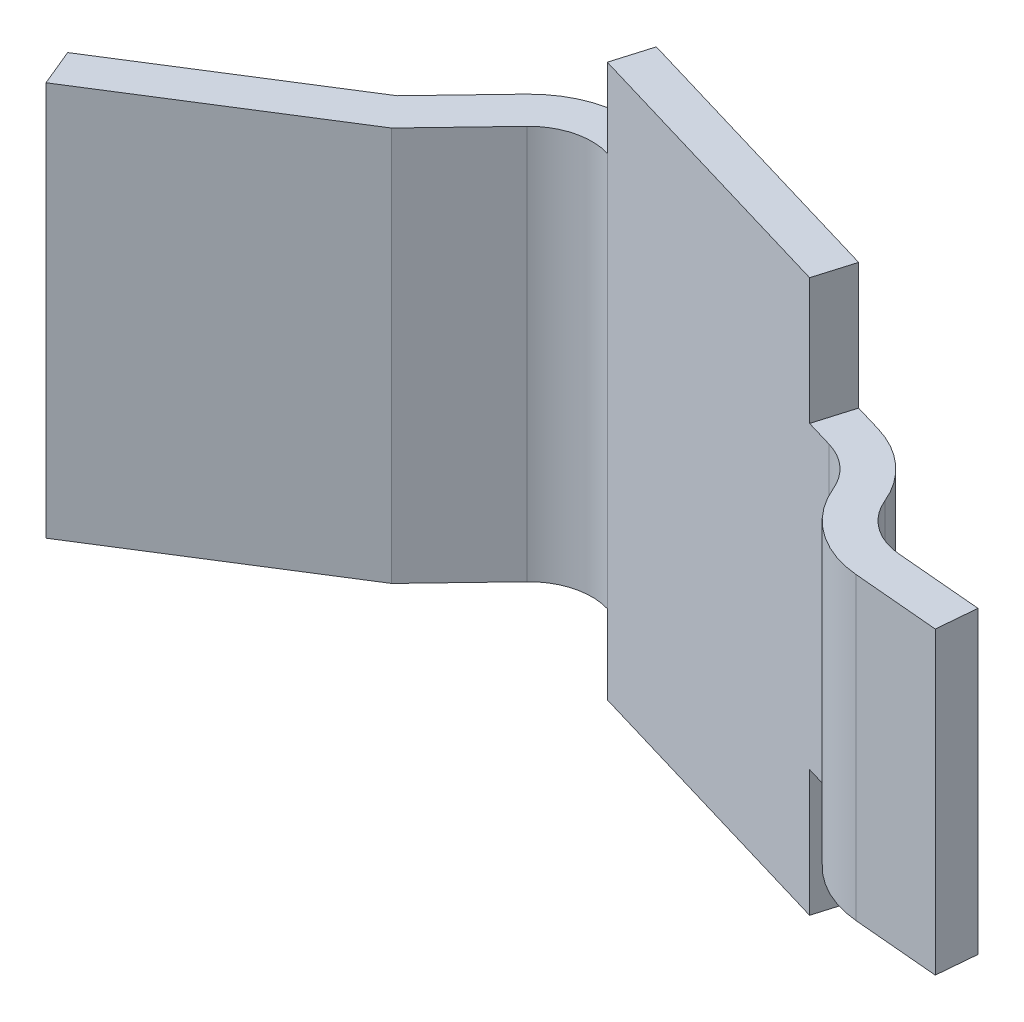
ISO-10303-21;
HEADER;
FILE_DESCRIPTION(('STEP AP214'),'2;1');
FILE_NAME('part.step','',(''),(''),'','','');
FILE_SCHEMA(('AUTOMOTIVE_DESIGN { 1 0 10303 214 1 1 1 1 }'));
ENDSEC;
DATA;
#1=APPLICATION_CONTEXT('core data for automotive mechanical design processes');
#2=APPLICATION_PROTOCOL_DEFINITION('international standard','automotive_design',2000,#1);
#3=PRODUCT_CONTEXT('',#1,'mechanical');
#4=PRODUCT('Part','Part','',(#3));
#5=PRODUCT_RELATED_PRODUCT_CATEGORY('part','',(#4));
#6=PRODUCT_DEFINITION_FORMATION('','',#4);
#7=PRODUCT_DEFINITION_CONTEXT('part definition',#1,'design');
#8=PRODUCT_DEFINITION('design','',#6,#7);
#9=PRODUCT_DEFINITION_SHAPE('','',#8);
#10=(LENGTH_UNIT() NAMED_UNIT(*) SI_UNIT(.MILLI.,.METRE.));
#11=(NAMED_UNIT(*) PLANE_ANGLE_UNIT() SI_UNIT($,.RADIAN.));
#12=(NAMED_UNIT(*) SI_UNIT($,.STERADIAN.) SOLID_ANGLE_UNIT());
#13=UNCERTAINTY_MEASURE_WITH_UNIT(LENGTH_MEASURE(1.E-05),#10,'distance_accuracy_value','');
#14=(GEOMETRIC_REPRESENTATION_CONTEXT(3) GLOBAL_UNCERTAINTY_ASSIGNED_CONTEXT((#13)) GLOBAL_UNIT_ASSIGNED_CONTEXT((#10,
#11,#12)) REPRESENTATION_CONTEXT('',''));
#15=CARTESIAN_POINT('',(0.,0.,0.));
#16=DIRECTION('',(0.,0.,1.));
#17=DIRECTION('',(1.,0.,0.));
#18=AXIS2_PLACEMENT_3D('',#15,#16,#17);
#19=CARTESIAN_POINT('',(-78.9724169244182,-9.50000000000003,-8.45872888493741));
#20=DIRECTION('',(0.,1.,0.));
#21=DIRECTION('',(0.,0.,1.));
#22=AXIS2_PLACEMENT_3D('',#19,#20,#21);
#23=CYLINDRICAL_SURFACE('',#22,6.5);
#24=CARTESIAN_POINT('',(-78.9724169244182,-9.50000000000003,-8.45872888493741));
#25=DIRECTION('',(0.,1.,0.));
#26=DIRECTION('',(0.,0.,1.));
#27=AXIS2_PLACEMENT_3D('',#24,#25,#26);
#28=CIRCLE('',#27,6.5);
#29=CARTESIAN_POINT('',(-79.5389292522779,-9.50000000000003,-1.98346334734095));
#30=VERTEX_POINT('',#29);
#31=CARTESIAN_POINT('',(-84.9782230087722,-9.50000000000003,-5.97270932002327));
#32=VERTEX_POINT('',#31);
#33=EDGE_CURVE('E195',#30,#32,#28,.F.);
#34=ORIENTED_EDGE('',*,*,#33,.F.);
#35=DIRECTION('',(0.,1.,0.));
#36=VECTOR('',#35,1.);
#37=CARTESIAN_POINT('',(-79.5389292522779,0.,-1.98346334734095));
#38=LINE('',#37,#36);
#39=CARTESIAN_POINT('',(-79.5389292522779,9.5,-1.98346334734095));
#40=VERTEX_POINT('',#39);
#41=EDGE_CURVE('E155',#40,#30,#38,.F.);
#42=ORIENTED_EDGE('',*,*,#41,.F.);
#43=CARTESIAN_POINT('',(-78.9724169244182,9.5,-8.45872888493741));
#44=DIRECTION('',(0.,1.,0.));
#45=DIRECTION('',(0.,0.,1.));
#46=AXIS2_PLACEMENT_3D('',#43,#44,#45);
#47=CIRCLE('',#46,6.5);
#48=CARTESIAN_POINT('',(-84.9782230087722,9.5,-5.97270932002327));
#49=VERTEX_POINT('',#48);
#50=EDGE_CURVE('E169',#49,#40,#47,.T.);
#51=ORIENTED_EDGE('',*,*,#50,.F.);
#52=DIRECTION('',(0.,1.,0.));
#53=VECTOR('',#52,1.);
#54=CARTESIAN_POINT('',(-84.9782230087721,0.,-5.9727093200233));
#55=LINE('',#54,#53);
#56=EDGE_CURVE('E270',#32,#49,#55,.T.);
#57=ORIENTED_EDGE('',*,*,#56,.F.);
#58=EDGE_LOOP('',(#34,#42,#51,#57));
#59=FACE_BOUND('',#58,.T.);
#60=ADVANCED_FACE('F17',(#59),#23,.T.);
#61=CARTESIAN_POINT('',(-74.0399120264485,0.,-1.50236167954712));
#62=DIRECTION('',(-0.0871557427476542,0.,0.996194698091746));
#63=DIRECTION('',(0.996194698091746,0.,0.0871557427476542));
#64=AXIS2_PLACEMENT_3D('',#61,#62,#63);
#65=PLANE('',#64);
#66=DIRECTION('',(-0.996194698091746,0.,-0.087155742747653));
#67=VECTOR('',#66,1.);
#68=CARTESIAN_POINT('',(-74.0399120264485,-9.50000000000003,-1.50236167954712));
#69=LINE('',#68,#67);
#70=CARTESIAN_POINT('',(-74.0399120264485,-9.50000000000002,-1.50236167954712));
#71=VERTEX_POINT('',#70);
#72=EDGE_CURVE('E150',#71,#30,#69,.T.);
#73=ORIENTED_EDGE('',*,*,#72,.F.);
#74=DIRECTION('',(0.,1.,0.));
#75=VECTOR('',#74,1.);
#76=CARTESIAN_POINT('',(-74.0399120264485,0.,-1.50236167954712));
#77=LINE('',#76,#75);
#78=CARTESIAN_POINT('',(-74.0399120264485,9.5,-1.50236167954712));
#79=VERTEX_POINT('',#78);
#80=EDGE_CURVE('E143',#79,#71,#77,.F.);
#81=ORIENTED_EDGE('',*,*,#80,.F.);
#82=DIRECTION('',(0.996194698091746,0.,0.0871557427476527));
#83=VECTOR('',#82,1.);
#84=CARTESIAN_POINT('',(-79.5389292522779,9.5,-1.98346334734094));
#85=LINE('',#84,#83);
#86=EDGE_CURVE('E147',#40,#79,#85,.T.);
#87=ORIENTED_EDGE('',*,*,#86,.F.);
#88=ORIENTED_EDGE('',*,*,#41,.T.);
#89=EDGE_LOOP('',(#73,#81,#87,#88));
#90=FACE_BOUND('',#89,.T.);
#91=ADVANCED_FACE('F145',(#90),#65,.T.);
#92=CARTESIAN_POINT('',(-73.8220226695794,0.,-3.99284842477648));
#93=DIRECTION('',(0.996194698091746,0.,0.0871557427476546));
#94=DIRECTION('',(0.0871557427476546,0.,-0.996194698091746));
#95=AXIS2_PLACEMENT_3D('',#92,#93,#94);
#96=PLANE('',#95);
#97=DIRECTION('',(-0.0871557427476403,0.,0.996194698091747));
#98=VECTOR('',#97,1.);
#99=CARTESIAN_POINT('',(-73.8220226695794,-9.50000000000003,-3.99284842477648));
#100=LINE('',#99,#98);
#101=CARTESIAN_POINT('',(-73.8220226695794,-9.50000000000002,-3.99284842477648));
#102=VERTEX_POINT('',#101);
#103=EDGE_CURVE('E196',#102,#71,#100,.T.);
#104=ORIENTED_EDGE('',*,*,#103,.F.);
#105=DIRECTION('',(0.,1.,0.));
#106=VECTOR('',#105,1.);
#107=CARTESIAN_POINT('',(-73.8220226695794,0.,-3.99284842477649));
#108=LINE('',#107,#106);
#109=CARTESIAN_POINT('',(-73.8220226695794,9.5,-3.99284842477648));
#110=VERTEX_POINT('',#109);
#111=EDGE_CURVE('E154',#110,#102,#108,.F.);
#112=ORIENTED_EDGE('',*,*,#111,.F.);
#113=DIRECTION('',(0.0871557427476403,0.,-0.996194698091747));
#114=VECTOR('',#113,1.);
#115=CARTESIAN_POINT('',(-74.0399120264485,9.5,-1.50236167954709));
#116=LINE('',#115,#114);
#117=EDGE_CURVE('E158',#79,#110,#116,.T.);
#118=ORIENTED_EDGE('',*,*,#117,.F.);
#119=ORIENTED_EDGE('',*,*,#80,.T.);
#120=EDGE_LOOP('',(#104,#112,#118,#119));
#121=FACE_BOUND('',#120,.T.);
#122=ADVANCED_FACE('F159',(#121),#96,.T.);
#123=CARTESIAN_POINT('',(-79.3210398954088,0.,-4.47395009257031));
#124=DIRECTION('',(0.0871557427476542,0.,-0.996194698091746));
#125=DIRECTION('',(-0.996194698091746,0.,-0.0871557427476542));
#126=AXIS2_PLACEMENT_3D('',#123,#124,#125);
#127=PLANE('',#126);
#128=DIRECTION('',(0.996194698091746,0.,0.0871557427476553));
#129=VECTOR('',#128,1.);
#130=CARTESIAN_POINT('',(-79.3210398954088,-9.50000000000003,-4.47395009257031));
#131=LINE('',#130,#129);
#132=CARTESIAN_POINT('',(-79.3210398954088,-9.50000000000003,-4.47395009257036));
#133=VERTEX_POINT('',#132);
#134=EDGE_CURVE('E199',#133,#102,#131,.T.);
#135=ORIENTED_EDGE('',*,*,#134,.F.);
#136=DIRECTION('',(0.,-1.,0.));
#137=VECTOR('',#136,1.);
#138=CARTESIAN_POINT('',(-79.3210398954088,0.,-4.4739500925704));
#139=LINE('',#138,#137);
#140=CARTESIAN_POINT('',(-79.3210398954088,9.5,-4.47395009257036));
#141=VERTEX_POINT('',#140);
#142=EDGE_CURVE('E260',#141,#133,#139,.T.);
#143=ORIENTED_EDGE('',*,*,#142,.F.);
#144=DIRECTION('',(-0.996194698091746,0.,-0.0871557427476553));
#145=VECTOR('',#144,1.);
#146=CARTESIAN_POINT('',(-73.8220226695794,9.5,-3.99284842477648));
#147=LINE('',#146,#145);
#148=EDGE_CURVE('E163',#110,#141,#147,.T.);
#149=ORIENTED_EDGE('',*,*,#148,.F.);
#150=ORIENTED_EDGE('',*,*,#111,.T.);
#151=EDGE_LOOP('',(#135,#143,#149,#150));
#152=FACE_BOUND('',#151,.T.);
#153=ADVANCED_FACE('F309',(#152),#127,.T.);
#154=CARTESIAN_POINT('',(-78.9724169244182,-9.50000000000003,-8.45872888493741));
#155=DIRECTION('',(0.,1.,0.));
#156=DIRECTION('',(0.,0.,1.));
#157=AXIS2_PLACEMENT_3D('',#154,#155,#156);
#158=CYLINDRICAL_SURFACE('',#157,4.00000000000002);
#159=CARTESIAN_POINT('',(-78.9724169244182,-9.50000000000003,-8.45872888493741));
#160=DIRECTION('',(0.,1.,0.));
#161=DIRECTION('',(0.,0.,1.));
#162=AXIS2_PLACEMENT_3D('',#159,#160,#161);
#163=CIRCLE('',#162,4.00000000000002);
#164=CARTESIAN_POINT('',(-82.668297591713,-9.50000000000003,-6.92887069114407));
#165=VERTEX_POINT('',#164);
#166=EDGE_CURVE('E202',#165,#133,#163,.T.);
#167=ORIENTED_EDGE('',*,*,#166,.F.);
#168=DIRECTION('',(0.,1.,0.));
#169=VECTOR('',#168,1.);
#170=CARTESIAN_POINT('',(-82.6682975917129,0.,-6.92887069114408));
#171=LINE('',#170,#169);
#172=CARTESIAN_POINT('',(-82.6682975917129,9.5,-6.92887069114408));
#173=VERTEX_POINT('',#172);
#174=EDGE_CURVE('E224',#173,#165,#171,.F.);
#175=ORIENTED_EDGE('',*,*,#174,.F.);
#176=CARTESIAN_POINT('',(-78.9724169244182,9.5,-8.45872888493741));
#177=DIRECTION('',(0.,1.,0.));
#178=DIRECTION('',(0.,0.,1.));
#179=AXIS2_PLACEMENT_3D('',#176,#177,#178);
#180=CIRCLE('',#179,4.00000000000002);
#181=EDGE_CURVE('E294',#141,#173,#180,.F.);
#182=ORIENTED_EDGE('',*,*,#181,.F.);
#183=ORIENTED_EDGE('',*,*,#142,.T.);
#184=EDGE_LOOP('',(#167,#175,#182,#183));
#185=FACE_BOUND('',#184,.T.);
#186=ADVANCED_FACE('F306',(#185),#158,.F.);
#187=CARTESIAN_POINT('',(-88.6741036760669,-9.50000000000003,-4.44285112622995));
#188=DIRECTION('',(0.,1.,0.));
#189=DIRECTION('',(0.,0.,1.));
#190=AXIS2_PLACEMENT_3D('',#187,#188,#189);
#191=CYLINDRICAL_SURFACE('',#190,6.4999999999999);
#192=CARTESIAN_POINT('',(-88.6741036760669,-9.50000000000003,-4.44285112622995));
#193=DIRECTION('',(0.,1.,0.));
#194=DIRECTION('',(0.,0.,1.));
#195=AXIS2_PLACEMENT_3D('',#192,#193,#194);
#196=CIRCLE('',#195,6.4999999999999);
#197=CARTESIAN_POINT('',(-86.8230359004681,-9.50000000000003,-10.6737056494988));
#198=VERTEX_POINT('',#197);
#199=EDGE_CURVE('E20',#198,#165,#196,.F.);
#200=ORIENTED_EDGE('',*,*,#199,.F.);
#201=DIRECTION('',(0.,1.,0.));
#202=VECTOR('',#201,1.);
#203=CARTESIAN_POINT('',(-86.8230359004681,0.,-10.6737056494988));
#204=LINE('',#203,#202);
#205=CARTESIAN_POINT('',(-86.8230359004681,9.5,-10.6737056494988));
#206=VERTEX_POINT('',#205);
#207=EDGE_CURVE('E248',#206,#198,#204,.F.);
#208=ORIENTED_EDGE('',*,*,#207,.F.);
#209=CARTESIAN_POINT('',(-88.6741036760669,9.5,-4.44285112622995));
#210=DIRECTION('',(0.,1.,0.));
#211=DIRECTION('',(0.,0.,1.));
#212=AXIS2_PLACEMENT_3D('',#209,#210,#211);
#213=CIRCLE('',#212,6.4999999999999);
#214=EDGE_CURVE('E231',#173,#206,#213,.T.);
#215=ORIENTED_EDGE('',*,*,#214,.F.);
#216=ORIENTED_EDGE('',*,*,#174,.T.);
#217=EDGE_LOOP('',(#200,#208,#215,#216));
#218=FACE_BOUND('',#217,.T.);
#219=ADVANCED_FACE('F303',(#218),#191,.T.);
#220=CARTESIAN_POINT('',(-106.837095544166,-12.5,-16.6195001993491));
#221=DIRECTION('',(-0.95859300357982,0.,-0.284779657784433));
#222=DIRECTION('',(-0.284779657784433,0.,0.95859300357982));
#223=AXIS2_PLACEMENT_3D('',#220,#221,#222);
#224=PLANE('',#223);
#225=DIRECTION('',(0.,1.,0.));
#226=VECTOR('',#225,1.);
#227=CARTESIAN_POINT('',(-106.837095544166,0.,-16.6195001993491));
#228=LINE('',#227,#226);
#229=CARTESIAN_POINT('',(-106.837095544166,-17.5,-16.6195001993491));
#230=VERTEX_POINT('',#229);
#231=CARTESIAN_POINT('',(-106.837095544166,-12.5,-16.6195001993491));
#232=VERTEX_POINT('',#231);
#233=EDGE_CURVE('E237',#230,#232,#228,.T.);
#234=ORIENTED_EDGE('',*,*,#233,.F.);
#235=DIRECTION('',(0.284779657784403,0.,-0.958593003579829));
#236=VECTOR('',#235,1.);
#237=CARTESIAN_POINT('',(-107.549044688627,-17.5,-14.2230176903995));
#238=LINE('',#237,#236);
#239=CARTESIAN_POINT('',(-107.549044688627,-17.5,-14.2230176903994));
#240=VERTEX_POINT('',#239);
#241=EDGE_CURVE('E215',#240,#230,#238,.T.);
#242=ORIENTED_EDGE('',*,*,#241,.F.);
#243=DIRECTION('',(0.,1.,0.));
#244=VECTOR('',#243,1.);
#245=CARTESIAN_POINT('',(-107.549044688627,0.,-14.2230176903994));
#246=LINE('',#245,#244);
#247=CARTESIAN_POINT('',(-107.549044688627,-12.5,-14.2230176903995));
#248=VERTEX_POINT('',#247);
#249=EDGE_CURVE('E220',#248,#240,#246,.F.);
#250=ORIENTED_EDGE('',*,*,#249,.F.);
#251=DIRECTION('',(-0.284779657784392,0.,0.958593003579832));
#252=VECTOR('',#251,1.);
#253=CARTESIAN_POINT('',(-106.837095544166,-12.5,-16.6195001993492));
#254=LINE('',#253,#252);
#255=EDGE_CURVE('E230',#232,#248,#254,.T.);
#256=ORIENTED_EDGE('',*,*,#255,.F.);
#257=EDGE_LOOP('',(#234,#242,#250,#256));
#258=FACE_BOUND('',#257,.T.);
#259=ADVANCED_FACE('F641',(#258),#224,.T.);
#260=CARTESIAN_POINT('',(-102.215795920617,-17.5,-8.88603985477391));
#261=DIRECTION('',(0.,-1.,0.));
#262=DIRECTION('',(0.,0.,-1.));
#263=AXIS2_PLACEMENT_3D('',#260,#261,#262);
#264=PLANE('',#263);
#265=DIRECTION('',(0.284779657784433,0.,-0.95859300357982));
#266=VECTOR('',#265,1.);
#267=CARTESIAN_POINT('',(-88.596554318209,-17.5,-11.2005840704683));
#268=LINE('',#267,#266);
#269=CARTESIAN_POINT('',(-89.30850346267,-17.5,-8.80410156151871));
#270=VERTEX_POINT('',#269);
#271=CARTESIAN_POINT('',(-88.596554318209,-17.5,-11.2005840704684));
#272=VERTEX_POINT('',#271);
#273=EDGE_CURVE('E206',#270,#272,#268,.T.);
#274=ORIENTED_EDGE('',*,*,#273,.F.);
#275=DIRECTION('',(0.95859300357982,0.,0.284779657784433));
#276=VECTOR('',#275,1.);
#277=CARTESIAN_POINT('',(-87.5349850449292,-17.5,-8.27722314054913));
#278=LINE('',#277,#276);
#279=EDGE_CURVE('E211',#240,#270,#278,.T.);
#280=ORIENTED_EDGE('',*,*,#279,.F.);
#281=ORIENTED_EDGE('',*,*,#241,.T.);
#282=DIRECTION('',(-0.95859300357982,0.,-0.284779657784433));
#283=VECTOR('',#282,1.);
#284=CARTESIAN_POINT('',(-106.837095544166,-17.5,-16.6195001993491));
#285=LINE('',#284,#283);
#286=EDGE_CURVE('E234',#272,#230,#285,.T.);
#287=ORIENTED_EDGE('',*,*,#286,.F.);
#288=EDGE_LOOP('',(#274,#280,#281,#287));
#289=FACE_BOUND('',#288,.T.);
#290=ADVANCED_FACE('F634',(#289),#264,.T.);
#291=CARTESIAN_POINT('',(-88.596554318209,9.49999999999999,-11.2005840704683));
#292=DIRECTION('',(0.95859300357982,0.,0.284779657784433));
#293=DIRECTION('',(0.284779657784433,0.,-0.95859300357982));
#294=AXIS2_PLACEMENT_3D('',#291,#292,#293);
#295=PLANE('',#294);
#296=DIRECTION('',(0.,1.,0.));
#297=VECTOR('',#296,1.);
#298=CARTESIAN_POINT('',(-88.596554318209,0.,-11.2005840704684));
#299=LINE('',#298,#297);
#300=CARTESIAN_POINT('',(-88.596554318209,-9.50000000000003,-11.2005840704684));
#301=VERTEX_POINT('',#300);
#302=EDGE_CURVE('E238',#301,#272,#299,.F.);
#303=ORIENTED_EDGE('',*,*,#302,.F.);
#304=DIRECTION('',(0.284779657784439,0.,-0.958593003579818));
#305=VECTOR('',#304,1.);
#306=CARTESIAN_POINT('',(-89.3085034626702,-9.50000000000003,-8.80410156151875));
#307=LINE('',#306,#305);
#308=CARTESIAN_POINT('',(-89.3085034626701,-9.50000000000003,-8.80410156151872));
#309=VERTEX_POINT('',#308);
#310=EDGE_CURVE('E116',#309,#301,#307,.T.);
#311=ORIENTED_EDGE('',*,*,#310,.F.);
#312=DIRECTION('',(0.,1.,0.));
#313=VECTOR('',#312,1.);
#314=CARTESIAN_POINT('',(-89.30850346267,0.,-8.8041015615187));
#315=LINE('',#314,#313);
#316=EDGE_CURVE('E191',#270,#309,#315,.T.);
#317=ORIENTED_EDGE('',*,*,#316,.F.);
#318=ORIENTED_EDGE('',*,*,#273,.T.);
#319=EDGE_LOOP('',(#303,#311,#317,#318));
#320=FACE_BOUND('',#319,.T.);
#321=ADVANCED_FACE('F322',(#320),#295,.T.);
#322=CARTESIAN_POINT('',(-88.5965543182091,-9.50000000000003,-11.2005840704683));
#323=DIRECTION('',(0.,-1.,0.));
#324=DIRECTION('',(0.,0.,-1.));
#325=AXIS2_PLACEMENT_3D('',#322,#323,#324);
#326=PLANE('',#325);
#327=ORIENTED_EDGE('',*,*,#33,.T.);
#328=CARTESIAN_POINT('',(-88.6741036760669,-9.50000000000003,-4.44285112622995));
#329=DIRECTION('',(0.,1.,0.));
#330=DIRECTION('',(0.,0.,1.));
#331=AXIS2_PLACEMENT_3D('',#328,#329,#330);
#332=CIRCLE('',#331,4.00000000000001);
#333=CARTESIAN_POINT('',(-87.5349850449292,-9.50000000000003,-8.27722314054913));
#334=VERTEX_POINT('',#333);
#335=EDGE_CURVE('E272',#334,#32,#332,.F.);
#336=ORIENTED_EDGE('',*,*,#335,.F.);
#337=DIRECTION('',(0.95859300357982,0.,0.284779657784433));
#338=VECTOR('',#337,1.);
#339=CARTESIAN_POINT('',(-87.5349850449292,-9.50000000000003,-8.27722314054913));
#340=LINE('',#339,#338);
#341=EDGE_CURVE('E183',#309,#334,#340,.T.);
#342=ORIENTED_EDGE('',*,*,#341,.F.);
#343=ORIENTED_EDGE('',*,*,#310,.T.);
#344=DIRECTION('',(-0.95859300357982,0.,-0.284779657784433));
#345=VECTOR('',#344,1.);
#346=CARTESIAN_POINT('',(-106.837095544166,-9.50000000000003,-16.6195001993491));
#347=LINE('',#346,#345);
#348=EDGE_CURVE('E243',#198,#301,#347,.T.);
#349=ORIENTED_EDGE('',*,*,#348,.F.);
#350=ORIENTED_EDGE('',*,*,#199,.T.);
#351=ORIENTED_EDGE('',*,*,#166,.T.);
#352=ORIENTED_EDGE('',*,*,#134,.T.);
#353=ORIENTED_EDGE('',*,*,#103,.T.);
#354=ORIENTED_EDGE('',*,*,#72,.T.);
#355=EDGE_LOOP('',(#327,#336,#342,#343,#349,#350,#351,#352,#353,#354));
#356=FACE_BOUND('',#355,.T.);
#357=ADVANCED_FACE('F301',(#356),#326,.T.);
#358=CARTESIAN_POINT('',(-88.6741036760669,-9.50000000000003,-4.44285112622995));
#359=DIRECTION('',(0.,1.,0.));
#360=DIRECTION('',(0.,0.,1.));
#361=AXIS2_PLACEMENT_3D('',#358,#359,#360);
#362=CYLINDRICAL_SURFACE('',#361,4.00000000000001);
#363=ORIENTED_EDGE('',*,*,#335,.T.);
#364=ORIENTED_EDGE('',*,*,#56,.T.);
#365=CARTESIAN_POINT('',(-88.6741036760669,9.5,-4.44285112622995));
#366=DIRECTION('',(0.,1.,0.));
#367=DIRECTION('',(0.,0.,1.));
#368=AXIS2_PLACEMENT_3D('',#365,#366,#367);
#369=CIRCLE('',#368,4.00000000000001);
#370=CARTESIAN_POINT('',(-87.5349850449292,9.5,-8.27722314054913));
#371=VERTEX_POINT('',#370);
#372=EDGE_CURVE('E171',#371,#49,#369,.F.);
#373=ORIENTED_EDGE('',*,*,#372,.F.);
#374=DIRECTION('',(0.,1.,0.));
#375=VECTOR('',#374,1.);
#376=CARTESIAN_POINT('',(-87.5349850449292,0.,-8.27722314054913));
#377=LINE('',#376,#375);
#378=EDGE_CURVE('E179',#334,#371,#377,.T.);
#379=ORIENTED_EDGE('',*,*,#378,.F.);
#380=EDGE_LOOP('',(#363,#364,#373,#379));
#381=FACE_BOUND('',#380,.T.);
#382=ADVANCED_FACE('F315',(#381),#362,.F.);
#383=CARTESIAN_POINT('',(-72.5729514876115,9.5,-6.44027796190064));
#384=DIRECTION('',(0.,1.,0.));
#385=DIRECTION('',(0.,0.,1.));
#386=AXIS2_PLACEMENT_3D('',#383,#384,#385);
#387=PLANE('',#386);
#388=ORIENTED_EDGE('',*,*,#181,.T.);
#389=ORIENTED_EDGE('',*,*,#214,.T.);
#390=DIRECTION('',(-0.95859300357982,0.,-0.284779657784433));
#391=VECTOR('',#390,1.);
#392=CARTESIAN_POINT('',(-106.837095544166,9.49999999999999,-16.6195001993491));
#393=LINE('',#392,#391);
#394=CARTESIAN_POINT('',(-88.596554318209,9.49999999999999,-11.2005840704684));
#395=VERTEX_POINT('',#394);
#396=EDGE_CURVE('E253',#395,#206,#393,.F.);
#397=ORIENTED_EDGE('',*,*,#396,.F.);
#398=DIRECTION('',(0.284779657784433,0.,-0.95859300357982));
#399=VECTOR('',#398,1.);
#400=CARTESIAN_POINT('',(-88.596554318209,9.49999999999999,-11.2005840704683));
#401=LINE('',#400,#399);
#402=CARTESIAN_POINT('',(-89.30850346267,9.49999999999999,-8.80410156151871));
#403=VERTEX_POINT('',#402);
#404=EDGE_CURVE('E227',#403,#395,#401,.T.);
#405=ORIENTED_EDGE('',*,*,#404,.F.);
#406=DIRECTION('',(0.95859300357982,0.,0.284779657784433));
#407=VECTOR('',#406,1.);
#408=CARTESIAN_POINT('',(-87.5349850449292,9.49999999999999,-8.27722314054913));
#409=LINE('',#408,#407);
#410=EDGE_CURVE('E182',#371,#403,#409,.F.);
#411=ORIENTED_EDGE('',*,*,#410,.F.);
#412=ORIENTED_EDGE('',*,*,#372,.T.);
#413=ORIENTED_EDGE('',*,*,#50,.T.);
#414=ORIENTED_EDGE('',*,*,#86,.T.);
#415=ORIENTED_EDGE('',*,*,#117,.T.);
#416=ORIENTED_EDGE('',*,*,#148,.T.);
#417=EDGE_LOOP('',(#388,#389,#397,#405,#411,#412,#413,#414,#415,#416));
#418=FACE_BOUND('',#417,.T.);
#419=ADVANCED_FACE('F166',(#418),#387,.T.);
#420=CARTESIAN_POINT('',(-88.596554318209,9.49999999999999,-11.2005840704683));
#421=DIRECTION('',(0.95859300357982,0.,0.284779657784433));
#422=DIRECTION('',(0.284779657784433,0.,-0.95859300357982));
#423=AXIS2_PLACEMENT_3D('',#420,#421,#422);
#424=PLANE('',#423);
#425=DIRECTION('',(0.,1.,0.));
#426=VECTOR('',#425,1.);
#427=CARTESIAN_POINT('',(-89.30850346267,0.,-8.8041015615187));
#428=LINE('',#427,#426);
#429=CARTESIAN_POINT('',(-89.30850346267,17.5,-8.8041015615187));
#430=VERTEX_POINT('',#429);
#431=EDGE_CURVE('E434',#403,#430,#428,.T.);
#432=ORIENTED_EDGE('',*,*,#431,.F.);
#433=ORIENTED_EDGE('',*,*,#404,.T.);
#434=DIRECTION('',(0.,1.,0.));
#435=VECTOR('',#434,1.);
#436=CARTESIAN_POINT('',(-88.596554318209,0.,-11.2005840704684));
#437=LINE('',#436,#435);
#438=CARTESIAN_POINT('',(-88.5965543182089,17.5,-11.2005840704683));
#439=VERTEX_POINT('',#438);
#440=EDGE_CURVE('E256',#439,#395,#437,.F.);
#441=ORIENTED_EDGE('',*,*,#440,.F.);
#442=DIRECTION('',(0.284779657784439,0.,-0.958593003579819));
#443=VECTOR('',#442,1.);
#444=CARTESIAN_POINT('',(-89.30850346267,17.5,-8.8041015615187));
#445=LINE('',#444,#443);
#446=EDGE_CURVE('E426',#430,#439,#445,.T.);
#447=ORIENTED_EDGE('',*,*,#446,.F.);
#448=EDGE_LOOP('',(#432,#433,#441,#447));
#449=FACE_BOUND('',#448,.T.);
#450=ADVANCED_FACE('F469',(#449),#424,.T.);
#451=CARTESIAN_POINT('',(-124.472992905289,-12.5,-21.8587881938015));
#452=DIRECTION('',(0.,-1.,0.));
#453=DIRECTION('',(0.,0.,-1.));
#454=AXIS2_PLACEMENT_3D('',#451,#452,#453);
#455=PLANE('',#454);
#456=CARTESIAN_POINT('',(-108.688163319765,-12.5,-10.3886456760803));
#457=DIRECTION('',(0.,1.,0.));
#458=DIRECTION('',(0.,0.,1.));
#459=AXIS2_PLACEMENT_3D('',#456,#457,#458);
#460=CIRCLE('',#459,6.50000000000004);
#461=CARTESIAN_POINT('',(-113.384585558102,-12.5,-14.8823766603797));
#462=VERTEX_POINT('',#461);
#463=EDGE_CURVE('E289',#232,#462,#460,.T.);
#464=ORIENTED_EDGE('',*,*,#463,.F.);
#465=ORIENTED_EDGE('',*,*,#255,.T.);
#466=CARTESIAN_POINT('',(-108.688163319765,-12.5,-10.3886456760803));
#467=DIRECTION('',(0.,1.,0.));
#468=DIRECTION('',(0.,0.,1.));
#469=AXIS2_PLACEMENT_3D('',#466,#467,#468);
#470=CIRCLE('',#469,4.00000000000005);
#471=CARTESIAN_POINT('',(-111.578269312588,-12.5,-13.1540185894953));
#472=VERTEX_POINT('',#471);
#473=EDGE_CURVE('E284',#472,#248,#470,.F.);
#474=ORIENTED_EDGE('',*,*,#473,.F.);
#475=DIRECTION('',(0.69134322835375,0.,-0.722526498205716));
#476=VECTOR('',#475,1.);
#477=CARTESIAN_POINT('',(-111.578269312588,-12.5,-13.1540185894953));
#478=LINE('',#477,#476);
#479=CARTESIAN_POINT('',(-115.770619748041,-12.5,-8.77257077146736));
#480=VERTEX_POINT('',#479);
#481=EDGE_CURVE('E373',#480,#472,#478,.T.);
#482=ORIENTED_EDGE('',*,*,#481,.F.);
#483=DIRECTION('',(0.846094390050455,0.,-0.533033097588835));
#484=VECTOR('',#483,1.);
#485=CARTESIAN_POINT('',(-115.770619748041,-12.5,-8.77257077146747));
#486=LINE('',#485,#484);
#487=CARTESIAN_POINT('',(-129.20952953013,-12.5,-0.306158756920595));
#488=VERTEX_POINT('',#487);
#489=EDGE_CURVE('E370',#488,#480,#486,.T.);
#490=ORIENTED_EDGE('',*,*,#489,.F.);
#491=DIRECTION('',(0.382464548448328,0.,0.9239701668237));
#492=VECTOR('',#491,1.);
#493=CARTESIAN_POINT('',(-129.20952953013,-12.5,-0.30615875692049));
#494=LINE('',#493,#492);
#495=CARTESIAN_POINT('',(-130.179629060713,-12.5,-2.64975642824627));
#496=VERTEX_POINT('',#495);
#497=EDGE_CURVE('E395',#496,#488,#494,.T.);
#498=ORIENTED_EDGE('',*,*,#497,.F.);
#499=DIRECTION('',(-0.846094390050455,0.,0.533033097588834));
#500=VECTOR('',#499,1.);
#501=CARTESIAN_POINT('',(-130.179629060713,-12.5,-2.64975642824621));
#502=LINE('',#501,#500);
#503=CARTESIAN_POINT('',(-117.363911123853,-12.5,-10.723562270762));
#504=VERTEX_POINT('',#503);
#505=EDGE_CURVE('E403',#504,#496,#502,.T.);
#506=ORIENTED_EDGE('',*,*,#505,.F.);
#507=DIRECTION('',(-0.69134322835375,0.,0.722526498205716));
#508=VECTOR('',#507,1.);
#509=CARTESIAN_POINT('',(-117.363911123853,-12.5,-10.7235622707619));
#510=LINE('',#509,#508);
#511=EDGE_CURVE('E412',#462,#504,#510,.T.);
#512=ORIENTED_EDGE('',*,*,#511,.F.);
#513=EDGE_LOOP('',(#464,#465,#474,#482,#490,#498,#506,#512));
#514=FACE_BOUND('',#513,.T.);
#515=ADVANCED_FACE('F501',(#514),#455,.T.);
#516=CARTESIAN_POINT('',(-106.837095544166,0.,-16.6195001993491));
#517=DIRECTION('',(0.284779657784433,0.,-0.95859300357982));
#518=DIRECTION('',(-0.95859300357982,0.,-0.284779657784433));
#519=AXIS2_PLACEMENT_3D('',#516,#517,#518);
#520=PLANE('',#519);
#521=DIRECTION('',(0.,1.,0.));
#522=VECTOR('',#521,1.);
#523=CARTESIAN_POINT('',(-106.837095544166,-12.5,-16.6195001993491));
#524=LINE('',#523,#522);
#525=CARTESIAN_POINT('',(-106.837095544166,17.5,-16.6195001993491));
#526=VERTEX_POINT('',#525);
#527=CARTESIAN_POINT('',(-106.837095544166,12.5,-16.6195001993491));
#528=VERTEX_POINT('',#527);
#529=EDGE_CURVE('E476',#526,#528,#524,.F.);
#530=ORIENTED_EDGE('',*,*,#529,.F.);
#531=DIRECTION('',(-0.958593003579819,0.,-0.284779657784438));
#532=VECTOR('',#531,1.);
#533=CARTESIAN_POINT('',(-88.596554318209,17.5,-11.2005840704683));
#534=LINE('',#533,#532);
#535=EDGE_CURVE('E419',#439,#526,#534,.T.);
#536=ORIENTED_EDGE('',*,*,#535,.F.);
#537=ORIENTED_EDGE('',*,*,#440,.T.);
#538=ORIENTED_EDGE('',*,*,#396,.T.);
#539=ORIENTED_EDGE('',*,*,#207,.T.);
#540=ORIENTED_EDGE('',*,*,#348,.T.);
#541=ORIENTED_EDGE('',*,*,#302,.T.);
#542=ORIENTED_EDGE('',*,*,#286,.T.);
#543=ORIENTED_EDGE('',*,*,#233,.T.);
#544=DIRECTION('',(0.,1.,0.));
#545=VECTOR('',#544,1.);
#546=CARTESIAN_POINT('',(-106.837095544166,0.,-16.6195001993492));
#547=LINE('',#546,#545);
#548=EDGE_CURVE('E292',#528,#232,#547,.F.);
#549=ORIENTED_EDGE('',*,*,#548,.F.);
#550=EDGE_LOOP('',(#530,#536,#537,#538,#539,#540,#541,#542,#543,#549));
#551=FACE_BOUND('',#550,.T.);
#552=ADVANCED_FACE('F326',(#551),#520,.T.);
#553=CARTESIAN_POINT('',(-87.5349850449292,0.,-8.27722314054913));
#554=DIRECTION('',(-0.284779657784433,0.,0.95859300357982));
#555=DIRECTION('',(0.95859300357982,0.,0.284779657784433));
#556=AXIS2_PLACEMENT_3D('',#553,#554,#555);
#557=PLANE('',#556);
#558=ORIENTED_EDGE('',*,*,#378,.T.);
#559=ORIENTED_EDGE('',*,*,#410,.T.);
#560=ORIENTED_EDGE('',*,*,#431,.T.);
#561=DIRECTION('',(0.958593003579819,0.,0.284779657784438));
#562=VECTOR('',#561,1.);
#563=CARTESIAN_POINT('',(-107.549044688627,17.5,-14.2230176903995));
#564=LINE('',#563,#562);
#565=CARTESIAN_POINT('',(-107.549044688627,17.5,-14.2230176903995));
#566=VERTEX_POINT('',#565);
#567=EDGE_CURVE('E186',#566,#430,#564,.T.);
#568=ORIENTED_EDGE('',*,*,#567,.F.);
#569=DIRECTION('',(0.,1.,0.));
#570=VECTOR('',#569,1.);
#571=CARTESIAN_POINT('',(-107.549044688627,-12.5,-14.2230176903995));
#572=LINE('',#571,#570);
#573=CARTESIAN_POINT('',(-107.549044688627,12.5,-14.2230176903995));
#574=VERTEX_POINT('',#573);
#575=EDGE_CURVE('E35',#574,#566,#572,.T.);
#576=ORIENTED_EDGE('',*,*,#575,.F.);
#577=DIRECTION('',(0.,1.,0.));
#578=VECTOR('',#577,1.);
#579=CARTESIAN_POINT('',(-107.549044688627,0.,-14.2230176903996));
#580=LINE('',#579,#578);
#581=EDGE_CURVE('E287',#248,#574,#580,.T.);
#582=ORIENTED_EDGE('',*,*,#581,.F.);
#583=ORIENTED_EDGE('',*,*,#249,.T.);
#584=ORIENTED_EDGE('',*,*,#279,.T.);
#585=ORIENTED_EDGE('',*,*,#316,.T.);
#586=ORIENTED_EDGE('',*,*,#341,.T.);
#587=EDGE_LOOP('',(#558,#559,#560,#568,#576,#582,#583,#584,#585,#586));
#588=FACE_BOUND('',#587,.T.);
#589=ADVANCED_FACE('F317',(#588),#557,.T.);
#590=CARTESIAN_POINT('',(-102.215795920617,17.5,-8.88603985477391));
#591=DIRECTION('',(0.,1.,0.));
#592=DIRECTION('',(0.,0.,1.));
#593=AXIS2_PLACEMENT_3D('',#590,#591,#592);
#594=PLANE('',#593);
#595=ORIENTED_EDGE('',*,*,#446,.T.);
#596=ORIENTED_EDGE('',*,*,#535,.T.);
#597=DIRECTION('',(-0.284779657784433,0.,0.95859300357982));
#598=VECTOR('',#597,1.);
#599=CARTESIAN_POINT('',(-106.837095544166,17.5,-16.6195001993491));
#600=LINE('',#599,#598);
#601=EDGE_CURVE('E283',#566,#526,#600,.F.);
#602=ORIENTED_EDGE('',*,*,#601,.F.);
#603=ORIENTED_EDGE('',*,*,#567,.T.);
#604=EDGE_LOOP('',(#595,#596,#602,#603));
#605=FACE_BOUND('',#604,.T.);
#606=ADVANCED_FACE('F471',(#605),#594,.T.);
#607=CARTESIAN_POINT('',(-108.688163319765,-12.5,-10.3886456760803));
#608=DIRECTION('',(0.,1.,0.));
#609=DIRECTION('',(0.,0.,1.));
#610=AXIS2_PLACEMENT_3D('',#607,#608,#609);
#611=CYLINDRICAL_SURFACE('',#610,6.50000000000004);
#612=ORIENTED_EDGE('',*,*,#463,.T.);
#613=DIRECTION('',(0.,1.,0.));
#614=VECTOR('',#613,1.);
#615=CARTESIAN_POINT('',(-113.384585558102,0.,-14.8823766603797));
#616=LINE('',#615,#614);
#617=CARTESIAN_POINT('',(-113.384585558102,12.5,-14.8823766603797));
#618=VERTEX_POINT('',#617);
#619=EDGE_CURVE('E291',#618,#462,#616,.F.);
#620=ORIENTED_EDGE('',*,*,#619,.F.);
#621=CARTESIAN_POINT('',(-108.688163319765,12.5,-10.3886456760803));
#622=DIRECTION('',(0.,1.,0.));
#623=DIRECTION('',(0.,0.,1.));
#624=AXIS2_PLACEMENT_3D('',#621,#622,#623);
#625=CIRCLE('',#624,6.50000000000004);
#626=EDGE_CURVE('E279',#528,#618,#625,.T.);
#627=ORIENTED_EDGE('',*,*,#626,.F.);
#628=ORIENTED_EDGE('',*,*,#548,.T.);
#629=EDGE_LOOP('',(#612,#620,#627,#628));
#630=FACE_BOUND('',#629,.T.);
#631=ADVANCED_FACE('F495',(#630),#611,.T.);
#632=CARTESIAN_POINT('',(-117.363911123853,0.,-10.7235622707619));
#633=DIRECTION('',(-0.722526498205716,0.,-0.69134322835375));
#634=DIRECTION('',(-0.69134322835375,0.,0.722526498205716));
#635=AXIS2_PLACEMENT_3D('',#632,#633,#634);
#636=PLANE('',#635);
#637=ORIENTED_EDGE('',*,*,#511,.T.);
#638=DIRECTION('',(0.,1.,0.));
#639=VECTOR('',#638,1.);
#640=CARTESIAN_POINT('',(-117.363911123853,0.,-10.723562270762));
#641=LINE('',#640,#639);
#642=CARTESIAN_POINT('',(-117.363911123853,12.5,-10.7235622707619));
#643=VERTEX_POINT('',#642);
#644=EDGE_CURVE('E409',#643,#504,#641,.F.);
#645=ORIENTED_EDGE('',*,*,#644,.F.);
#646=DIRECTION('',(-0.691343228353767,0.,0.7225264982057));
#647=VECTOR('',#646,1.);
#648=CARTESIAN_POINT('',(-113.384585558102,12.5,-14.8823766603797));
#649=LINE('',#648,#647);
#650=EDGE_CURVE('E282',#618,#643,#649,.T.);
#651=ORIENTED_EDGE('',*,*,#650,.F.);
#652=ORIENTED_EDGE('',*,*,#619,.T.);
#653=EDGE_LOOP('',(#637,#645,#651,#652));
#654=FACE_BOUND('',#653,.T.);
#655=ADVANCED_FACE('F505',(#654),#636,.T.);
#656=CARTESIAN_POINT('',(-130.179629060713,0.,-2.64975642824621));
#657=DIRECTION('',(-0.533033097588834,0.,-0.846094390050455));
#658=DIRECTION('',(-0.846094390050455,0.,0.533033097588834));
#659=AXIS2_PLACEMENT_3D('',#656,#657,#658);
#660=PLANE('',#659);
#661=ORIENTED_EDGE('',*,*,#505,.T.);
#662=DIRECTION('',(0.,1.,0.));
#663=VECTOR('',#662,1.);
#664=CARTESIAN_POINT('',(-130.179629060713,0.,-2.6497564282463));
#665=LINE('',#664,#663);
#666=CARTESIAN_POINT('',(-130.179629060713,12.5,-2.64975642824624));
#667=VERTEX_POINT('',#666);
#668=EDGE_CURVE('E400',#667,#496,#665,.F.);
#669=ORIENTED_EDGE('',*,*,#668,.F.);
#670=DIRECTION('',(-0.846094390050461,0.,0.533033097588826));
#671=VECTOR('',#670,1.);
#672=CARTESIAN_POINT('',(-117.363911123853,12.5,-10.7235622707619));
#673=LINE('',#672,#671);
#674=EDGE_CURVE('E386',#643,#667,#673,.T.);
#675=ORIENTED_EDGE('',*,*,#674,.F.);
#676=ORIENTED_EDGE('',*,*,#644,.T.);
#677=EDGE_LOOP('',(#661,#669,#675,#676));
#678=FACE_BOUND('',#677,.T.);
#679=ADVANCED_FACE('F510',(#678),#660,.T.);
#680=CARTESIAN_POINT('',(-129.20952953013,0.,-0.30615875692049));
#681=DIRECTION('',(-0.9239701668237,0.,0.382464548448328));
#682=DIRECTION('',(0.382464548448328,0.,0.9239701668237));
#683=AXIS2_PLACEMENT_3D('',#680,#681,#682);
#684=PLANE('',#683);
#685=ORIENTED_EDGE('',*,*,#497,.T.);
#686=DIRECTION('',(0.,1.,0.));
#687=VECTOR('',#686,1.);
#688=CARTESIAN_POINT('',(-129.20952953013,0.,-0.306158756920649));
#689=LINE('',#688,#687);
#690=CARTESIAN_POINT('',(-129.20952953013,12.5,-0.306158756920544));
#691=VERTEX_POINT('',#690);
#692=EDGE_CURVE('E393',#691,#488,#689,.F.);
#693=ORIENTED_EDGE('',*,*,#692,.F.);
#694=DIRECTION('',(0.382464548448408,0.,0.923970166823667));
#695=VECTOR('',#694,1.);
#696=CARTESIAN_POINT('',(-130.179629060713,12.5,-2.64975642824621));
#697=LINE('',#696,#695);
#698=EDGE_CURVE('E384',#667,#691,#697,.T.);
#699=ORIENTED_EDGE('',*,*,#698,.F.);
#700=ORIENTED_EDGE('',*,*,#668,.T.);
#701=EDGE_LOOP('',(#685,#693,#699,#700));
#702=FACE_BOUND('',#701,.T.);
#703=ADVANCED_FACE('F512',(#702),#684,.T.);
#704=CARTESIAN_POINT('',(-115.770619748041,0.,-8.77257077146747));
#705=DIRECTION('',(0.533033097588835,0.,0.846094390050455));
#706=DIRECTION('',(0.846094390050455,0.,-0.533033097588835));
#707=AXIS2_PLACEMENT_3D('',#704,#705,#706);
#708=PLANE('',#707);
#709=ORIENTED_EDGE('',*,*,#489,.T.);
#710=DIRECTION('',(0.,1.,0.));
#711=VECTOR('',#710,1.);
#712=CARTESIAN_POINT('',(-115.770619748041,0.,-8.7725707714673));
#713=LINE('',#712,#711);
#714=CARTESIAN_POINT('',(-115.770619748041,12.5,-8.77257077146743));
#715=VERTEX_POINT('',#714);
#716=EDGE_CURVE('E362',#715,#480,#713,.F.);
#717=ORIENTED_EDGE('',*,*,#716,.F.);
#718=DIRECTION('',(0.846094390050449,0.,-0.533033097588845));
#719=VECTOR('',#718,1.);
#720=CARTESIAN_POINT('',(-129.20952953013,12.5,-0.306158756920492));
#721=LINE('',#720,#719);
#722=EDGE_CURVE('E367',#691,#715,#721,.T.);
#723=ORIENTED_EDGE('',*,*,#722,.F.);
#724=ORIENTED_EDGE('',*,*,#692,.T.);
#725=EDGE_LOOP('',(#709,#717,#723,#724));
#726=FACE_BOUND('',#725,.T.);
#727=ADVANCED_FACE('F364',(#726),#708,.T.);
#728=CARTESIAN_POINT('',(-111.578269312588,0.,-13.1540185894953));
#729=DIRECTION('',(0.722526498205716,0.,0.69134322835375));
#730=DIRECTION('',(0.69134322835375,0.,-0.722526498205716));
#731=AXIS2_PLACEMENT_3D('',#728,#729,#730);
#732=PLANE('',#731);
#733=ORIENTED_EDGE('',*,*,#481,.T.);
#734=DIRECTION('',(0.,-1.,0.));
#735=VECTOR('',#734,1.);
#736=CARTESIAN_POINT('',(-111.578269312588,0.,-13.1540185894953));
#737=LINE('',#736,#735);
#738=CARTESIAN_POINT('',(-111.578269312588,12.5,-13.1540185894954));
#739=VERTEX_POINT('',#738);
#740=EDGE_CURVE('E288',#739,#472,#737,.T.);
#741=ORIENTED_EDGE('',*,*,#740,.F.);
#742=DIRECTION('',(0.691343228353779,0.,-0.722526498205688));
#743=VECTOR('',#742,1.);
#744=CARTESIAN_POINT('',(-115.770619748041,12.5,-8.77257077146747));
#745=LINE('',#744,#743);
#746=EDGE_CURVE('E278',#715,#739,#745,.T.);
#747=ORIENTED_EDGE('',*,*,#746,.F.);
#748=ORIENTED_EDGE('',*,*,#716,.T.);
#749=EDGE_LOOP('',(#733,#741,#747,#748));
#750=FACE_BOUND('',#749,.T.);
#751=ADVANCED_FACE('F376',(#750),#732,.T.);
#752=CARTESIAN_POINT('',(-108.688163319765,-12.5,-10.3886456760803));
#753=DIRECTION('',(0.,1.,0.));
#754=DIRECTION('',(0.,0.,1.));
#755=AXIS2_PLACEMENT_3D('',#752,#753,#754);
#756=CYLINDRICAL_SURFACE('',#755,4.00000000000005);
#757=ORIENTED_EDGE('',*,*,#473,.T.);
#758=ORIENTED_EDGE('',*,*,#581,.T.);
#759=CARTESIAN_POINT('',(-108.688163319765,12.5,-10.3886456760803));
#760=DIRECTION('',(0.,1.,0.));
#761=DIRECTION('',(0.,0.,1.));
#762=AXIS2_PLACEMENT_3D('',#759,#760,#761);
#763=CIRCLE('',#762,4.00000000000005);
#764=EDGE_CURVE('E26',#739,#574,#763,.F.);
#765=ORIENTED_EDGE('',*,*,#764,.F.);
#766=ORIENTED_EDGE('',*,*,#740,.T.);
#767=EDGE_LOOP('',(#757,#758,#765,#766));
#768=FACE_BOUND('',#767,.T.);
#769=ADVANCED_FACE('F489',(#768),#756,.F.);
#770=CARTESIAN_POINT('',(-106.837095544166,-12.5,-16.6195001993491));
#771=DIRECTION('',(-0.95859300357982,0.,-0.284779657784433));
#772=DIRECTION('',(-0.284779657784433,0.,0.95859300357982));
#773=AXIS2_PLACEMENT_3D('',#770,#771,#772);
#774=PLANE('',#773);
#775=ORIENTED_EDGE('',*,*,#575,.T.);
#776=ORIENTED_EDGE('',*,*,#601,.T.);
#777=ORIENTED_EDGE('',*,*,#529,.T.);
#778=DIRECTION('',(0.284779657784392,0.,-0.958593003579832));
#779=VECTOR('',#778,1.);
#780=CARTESIAN_POINT('',(-107.549044688627,12.5,-14.2230176903995));
#781=LINE('',#780,#779);
#782=EDGE_CURVE('E11',#574,#528,#781,.T.);
#783=ORIENTED_EDGE('',*,*,#782,.F.);
#784=EDGE_LOOP('',(#775,#776,#777,#783));
#785=FACE_BOUND('',#784,.T.);
#786=ADVANCED_FACE('F475',(#785),#774,.T.);
#787=CARTESIAN_POINT('',(-106.837095544166,12.5,-16.6195001993491));
#788=DIRECTION('',(0.,1.,0.));
#789=DIRECTION('',(0.,0.,1.));
#790=AXIS2_PLACEMENT_3D('',#787,#788,#789);
#791=PLANE('',#790);
#792=ORIENTED_EDGE('',*,*,#764,.T.);
#793=ORIENTED_EDGE('',*,*,#782,.T.);
#794=ORIENTED_EDGE('',*,*,#626,.T.);
#795=ORIENTED_EDGE('',*,*,#650,.T.);
#796=ORIENTED_EDGE('',*,*,#674,.T.);
#797=ORIENTED_EDGE('',*,*,#698,.T.);
#798=ORIENTED_EDGE('',*,*,#722,.T.);
#799=ORIENTED_EDGE('',*,*,#746,.T.);
#800=EDGE_LOOP('',(#792,#793,#794,#795,#796,#797,#798,#799));
#801=FACE_BOUND('',#800,.T.);
#802=ADVANCED_FACE('F381',(#801),#791,.T.);
#803=CLOSED_SHELL('',(#60,#91,#122,#153,#186,#219,#259,#290,#321,#357,#382,#419,#450,#515,#552,
#589,#606,#631,#655,#679,#703,#727,#751,#769,#786,#802));
#804=MANIFOLD_SOLID_BREP('B1',#803);
#805=ADVANCED_BREP_SHAPE_REPRESENTATION('',(#18,#804),#14);
#806=SHAPE_DEFINITION_REPRESENTATION(#9,#805);
ENDSEC;
END-ISO-10303-21;
